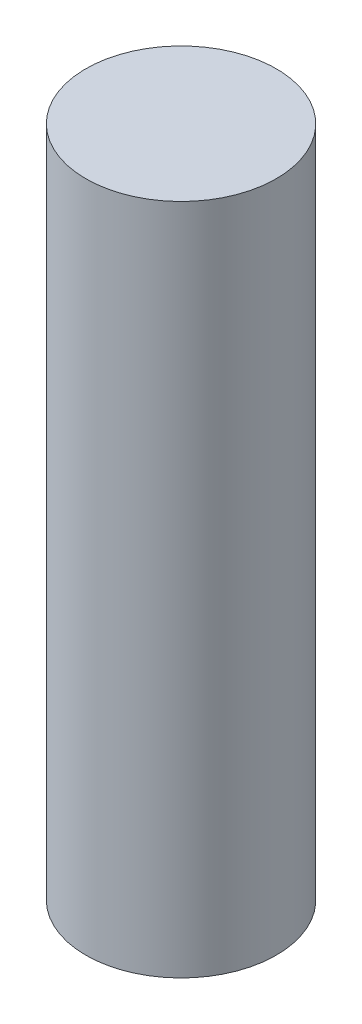
ISO-10303-21;
HEADER;
FILE_DESCRIPTION(('STEP AP214'),'2;1');
FILE_NAME('part.step','',(''),(''),'','','');
FILE_SCHEMA(('AUTOMOTIVE_DESIGN { 1 0 10303 214 1 1 1 1 }'));
ENDSEC;
DATA;
#1=APPLICATION_CONTEXT('core data for automotive mechanical design processes');
#2=APPLICATION_PROTOCOL_DEFINITION('international standard','automotive_design',2000,#1);
#3=PRODUCT_CONTEXT('',#1,'mechanical');
#4=PRODUCT('Part','Part','',(#3));
#5=PRODUCT_RELATED_PRODUCT_CATEGORY('part','',(#4));
#6=PRODUCT_DEFINITION_FORMATION('','',#4);
#7=PRODUCT_DEFINITION_CONTEXT('part definition',#1,'design');
#8=PRODUCT_DEFINITION('design','',#6,#7);
#9=PRODUCT_DEFINITION_SHAPE('','',#8);
#10=(LENGTH_UNIT() NAMED_UNIT(*) SI_UNIT(.MILLI.,.METRE.));
#11=(NAMED_UNIT(*) PLANE_ANGLE_UNIT() SI_UNIT($,.RADIAN.));
#12=(NAMED_UNIT(*) SI_UNIT($,.STERADIAN.) SOLID_ANGLE_UNIT());
#13=UNCERTAINTY_MEASURE_WITH_UNIT(LENGTH_MEASURE(1.E-05),#10,'distance_accuracy_value','');
#14=(GEOMETRIC_REPRESENTATION_CONTEXT(3) GLOBAL_UNCERTAINTY_ASSIGNED_CONTEXT((#13)) GLOBAL_UNIT_ASSIGNED_CONTEXT((#10,
#11,#12)) REPRESENTATION_CONTEXT('',''));
#15=CARTESIAN_POINT('',(0.,0.,0.));
#16=DIRECTION('',(0.,0.,1.));
#17=DIRECTION('',(1.,0.,0.));
#18=AXIS2_PLACEMENT_3D('',#15,#16,#17);
#19=CARTESIAN_POINT('',(0.,6.,0.));
#20=DIRECTION('',(0.,-1.,0.));
#21=DIRECTION('',(0.,0.,-1.));
#22=AXIS2_PLACEMENT_3D('',#19,#20,#21);
#23=CYLINDRICAL_SURFACE('',#22,0.85);
#24=CARTESIAN_POINT('',(0.,6.,0.));
#25=DIRECTION('',(0.,1.,0.));
#26=DIRECTION('',(0.,0.,1.));
#27=AXIS2_PLACEMENT_3D('',#24,#25,#26);
#28=CIRCLE('',#27,0.85);
#29=CARTESIAN_POINT('',(0.,6.,0.85));
#30=VERTEX_POINT('',#29);
#31=EDGE_CURVE('E10',#30,#30,#28,.T.);
#32=ORIENTED_EDGE('',*,*,#31,.F.);
#33=EDGE_LOOP('',(#32));
#34=FACE_BOUND('',#33,.T.);
#35=CARTESIAN_POINT('',(0.,0.,0.));
#36=DIRECTION('',(0.,1.,0.));
#37=DIRECTION('',(0.,0.,1.));
#38=AXIS2_PLACEMENT_3D('',#35,#36,#37);
#39=CIRCLE('',#38,0.85);
#40=CARTESIAN_POINT('',(0.,0.,0.85));
#41=VERTEX_POINT('',#40);
#42=EDGE_CURVE('E46',#41,#41,#39,.T.);
#43=ORIENTED_EDGE('',*,*,#42,.T.);
#44=EDGE_LOOP('',(#43));
#45=FACE_BOUND('',#44,.T.);
#46=ADVANCED_FACE('F43',(#34,#45),#23,.T.);
#47=CARTESIAN_POINT('',(0.,6.,0.));
#48=DIRECTION('',(0.,1.,0.));
#49=DIRECTION('',(0.,0.,1.));
#50=AXIS2_PLACEMENT_3D('',#47,#48,#49);
#51=PLANE('',#50);
#52=ORIENTED_EDGE('',*,*,#31,.T.);
#53=EDGE_LOOP('',(#52));
#54=FACE_BOUND('',#53,.T.);
#55=ADVANCED_FACE('F60',(#54),#51,.T.);
#56=CARTESIAN_POINT('',(0.,0.,0.));
#57=DIRECTION('',(0.,1.,0.));
#58=DIRECTION('',(0.,0.,1.));
#59=AXIS2_PLACEMENT_3D('',#56,#57,#58);
#60=PLANE('',#59);
#61=ORIENTED_EDGE('',*,*,#42,.F.);
#62=EDGE_LOOP('',(#61));
#63=FACE_BOUND('',#62,.T.);
#64=ADVANCED_FACE('F58',(#63),#60,.F.);
#65=CLOSED_SHELL('',(#46,#55,#64));
#66=MANIFOLD_SOLID_BREP('B2',#65);
#67=ADVANCED_BREP_SHAPE_REPRESENTATION('',(#18,#66),#14);
#68=SHAPE_DEFINITION_REPRESENTATION(#9,#67);
ENDSEC;
END-ISO-10303-21;
